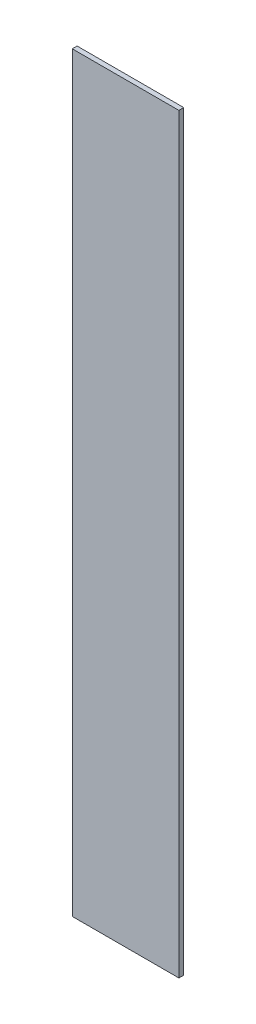
ISO-10303-21;
HEADER;
FILE_DESCRIPTION(('STEP AP214'),'2;1');
FILE_NAME('part.step','',(''),(''),'','','');
FILE_SCHEMA(('AUTOMOTIVE_DESIGN { 1 0 10303 214 1 1 1 1 }'));
ENDSEC;
DATA;
#1=APPLICATION_CONTEXT('core data for automotive mechanical design processes');
#2=APPLICATION_PROTOCOL_DEFINITION('international standard','automotive_design',2000,#1);
#3=PRODUCT_CONTEXT('',#1,'mechanical');
#4=PRODUCT('Part','Part','',(#3));
#5=PRODUCT_RELATED_PRODUCT_CATEGORY('part','',(#4));
#6=PRODUCT_DEFINITION_FORMATION('','',#4);
#7=PRODUCT_DEFINITION_CONTEXT('part definition',#1,'design');
#8=PRODUCT_DEFINITION('design','',#6,#7);
#9=PRODUCT_DEFINITION_SHAPE('','',#8);
#10=(LENGTH_UNIT() NAMED_UNIT(*) SI_UNIT(.MILLI.,.METRE.));
#11=(NAMED_UNIT(*) PLANE_ANGLE_UNIT() SI_UNIT($,.RADIAN.));
#12=(NAMED_UNIT(*) SI_UNIT($,.STERADIAN.) SOLID_ANGLE_UNIT());
#13=UNCERTAINTY_MEASURE_WITH_UNIT(LENGTH_MEASURE(1.E-05),#10,'distance_accuracy_value','');
#14=(GEOMETRIC_REPRESENTATION_CONTEXT(3) GLOBAL_UNCERTAINTY_ASSIGNED_CONTEXT((#13)) GLOBAL_UNIT_ASSIGNED_CONTEXT((#10,
#11,#12)) REPRESENTATION_CONTEXT('',''));
#15=CARTESIAN_POINT('',(0.,0.,0.));
#16=DIRECTION('',(0.,0.,1.));
#17=DIRECTION('',(1.,0.,0.));
#18=AXIS2_PLACEMENT_3D('',#15,#16,#17);
#19=CARTESIAN_POINT('',(-5.32499999999902,3.97499999999934,0.0762));
#20=DIRECTION('',(0.,0.,-1.));
#21=DIRECTION('',(-1.,0.,0.));
#22=AXIS2_PLACEMENT_3D('',#19,#20,#21);
#23=PLANE('',#22);
#24=DIRECTION('',(0.,1.,0.));
#25=VECTOR('',#24,1.);
#26=CARTESIAN_POINT('',(-1.64000000000004,3.1250000000002,0.0762));
#27=LINE('',#26,#25);
#28=CARTESIAN_POINT('',(-1.64000000000004,3.1250000000002,0.0762));
#29=VERTEX_POINT('',#28);
#30=CARTESIAN_POINT('',(-1.64000000000004,4.67499999999908,0.0762));
#31=VERTEX_POINT('',#30);
#32=EDGE_CURVE('E20',#29,#31,#27,.T.);
#33=ORIENTED_EDGE('',*,*,#32,.F.);
#34=DIRECTION('',(1.,0.,0.));
#35=VECTOR('',#34,1.);
#36=CARTESIAN_POINT('',(-1.85999999999993,3.1250000000002,0.0762));
#37=LINE('',#36,#35);
#38=CARTESIAN_POINT('',(-1.85999999999993,3.1250000000002,0.0762));
#39=VERTEX_POINT('',#38);
#40=EDGE_CURVE('E81',#39,#29,#37,.T.);
#41=ORIENTED_EDGE('',*,*,#40,.F.);
#42=DIRECTION('',(0.,1.,0.));
#43=VECTOR('',#42,1.);
#44=CARTESIAN_POINT('',(-1.85999999999993,4.67499999999908,0.0762));
#45=LINE('',#44,#43);
#46=CARTESIAN_POINT('',(-1.85999999999993,4.67499999999908,0.0762));
#47=VERTEX_POINT('',#46);
#48=EDGE_CURVE('E68',#47,#39,#45,.F.);
#49=ORIENTED_EDGE('',*,*,#48,.F.);
#50=DIRECTION('',(1.,0.,0.));
#51=VECTOR('',#50,1.);
#52=CARTESIAN_POINT('',(-1.64000000000004,4.67499999999908,0.0762));
#53=LINE('',#52,#51);
#54=EDGE_CURVE('E55',#31,#47,#53,.F.);
#55=ORIENTED_EDGE('',*,*,#54,.F.);
#56=EDGE_LOOP('',(#33,#41,#49,#55));
#57=FACE_BOUND('',#56,.T.);
#58=ADVANCED_FACE('F17',(#57),#23,.T.);
#59=CARTESIAN_POINT('',(-1.64000000000004,3.1250000000002,0.0762));
#60=DIRECTION('',(1.,0.,0.));
#61=DIRECTION('',(0.,0.,-1.));
#62=AXIS2_PLACEMENT_3D('',#59,#60,#61);
#63=PLANE('',#62);
#64=DIRECTION('',(0.,0.,-1.));
#65=VECTOR('',#64,1.);
#66=CARTESIAN_POINT('',(-1.64000000000004,3.1250000000002,0.0762));
#67=LINE('',#66,#65);
#68=CARTESIAN_POINT('',(-1.64000000000004,3.1250000000002,0.0862000000000108));
#69=VERTEX_POINT('',#68);
#70=EDGE_CURVE('E64',#29,#69,#67,.F.);
#71=ORIENTED_EDGE('',*,*,#70,.F.);
#72=ORIENTED_EDGE('',*,*,#32,.T.);
#73=DIRECTION('',(0.,0.,1.));
#74=VECTOR('',#73,1.);
#75=CARTESIAN_POINT('',(-1.64000000000004,4.67499999999908,0.0762));
#76=LINE('',#75,#74);
#77=CARTESIAN_POINT('',(-1.64000000000004,4.67499999999908,0.0862000000000108));
#78=VERTEX_POINT('',#77);
#79=EDGE_CURVE('E61',#78,#31,#76,.F.);
#80=ORIENTED_EDGE('',*,*,#79,.F.);
#81=DIRECTION('',(0.,1.,0.));
#82=VECTOR('',#81,1.);
#83=CARTESIAN_POINT('',(-1.64000000000004,0.,0.0862000000000108));
#84=LINE('',#83,#82);
#85=EDGE_CURVE('E83',#69,#78,#84,.T.);
#86=ORIENTED_EDGE('',*,*,#85,.F.);
#87=EDGE_LOOP('',(#71,#72,#80,#86));
#88=FACE_BOUND('',#87,.T.);
#89=ADVANCED_FACE('F60',(#88),#63,.T.);
#90=CARTESIAN_POINT('',(-1.64000000000004,4.67499999999908,0.0762));
#91=DIRECTION('',(0.,1.,0.));
#92=DIRECTION('',(0.,0.,1.));
#93=AXIS2_PLACEMENT_3D('',#90,#91,#92);
#94=PLANE('',#93);
#95=ORIENTED_EDGE('',*,*,#79,.T.);
#96=ORIENTED_EDGE('',*,*,#54,.T.);
#97=DIRECTION('',(0.,0.,1.));
#98=VECTOR('',#97,1.);
#99=CARTESIAN_POINT('',(-1.85999999999993,4.67499999999908,0.0762));
#100=LINE('',#99,#98);
#101=CARTESIAN_POINT('',(-1.85999999999993,4.67499999999908,0.0862000000000108));
#102=VERTEX_POINT('',#101);
#103=EDGE_CURVE('E70',#102,#47,#100,.F.);
#104=ORIENTED_EDGE('',*,*,#103,.F.);
#105=DIRECTION('',(1.,0.,0.));
#106=VECTOR('',#105,1.);
#107=CARTESIAN_POINT('',(0.,4.67499999999908,0.0862000000000108));
#108=LINE('',#107,#106);
#109=EDGE_CURVE('E74',#78,#102,#108,.F.);
#110=ORIENTED_EDGE('',*,*,#109,.F.);
#111=EDGE_LOOP('',(#95,#96,#104,#110));
#112=FACE_BOUND('',#111,.T.);
#113=ADVANCED_FACE('F72',(#112),#94,.T.);
#114=CARTESIAN_POINT('',(-1.85999999999993,4.67499999999908,0.0762));
#115=DIRECTION('',(-1.,0.,0.));
#116=DIRECTION('',(0.,0.,1.));
#117=AXIS2_PLACEMENT_3D('',#114,#115,#116);
#118=PLANE('',#117);
#119=ORIENTED_EDGE('',*,*,#103,.T.);
#120=ORIENTED_EDGE('',*,*,#48,.T.);
#121=DIRECTION('',(0.,0.,-1.));
#122=VECTOR('',#121,1.);
#123=CARTESIAN_POINT('',(-1.85999999999993,3.1250000000002,0.0762));
#124=LINE('',#123,#122);
#125=CARTESIAN_POINT('',(-1.85999999999993,3.1250000000002,0.0862000000000108));
#126=VERTEX_POINT('',#125);
#127=EDGE_CURVE('E35',#126,#39,#124,.T.);
#128=ORIENTED_EDGE('',*,*,#127,.F.);
#129=DIRECTION('',(0.,1.,0.));
#130=VECTOR('',#129,1.);
#131=CARTESIAN_POINT('',(-1.85999999999993,0.,0.0862000000000108));
#132=LINE('',#131,#130);
#133=EDGE_CURVE('E26',#102,#126,#132,.F.);
#134=ORIENTED_EDGE('',*,*,#133,.F.);
#135=EDGE_LOOP('',(#119,#120,#128,#134));
#136=FACE_BOUND('',#135,.T.);
#137=ADVANCED_FACE('F89',(#136),#118,.T.);
#138=CARTESIAN_POINT('',(-1.85999999999993,3.1250000000002,0.0762));
#139=DIRECTION('',(0.,-1.,0.));
#140=DIRECTION('',(0.,0.,-1.));
#141=AXIS2_PLACEMENT_3D('',#138,#139,#140);
#142=PLANE('',#141);
#143=ORIENTED_EDGE('',*,*,#127,.T.);
#144=ORIENTED_EDGE('',*,*,#40,.T.);
#145=ORIENTED_EDGE('',*,*,#70,.T.);
#146=DIRECTION('',(1.,0.,0.));
#147=VECTOR('',#146,1.);
#148=CARTESIAN_POINT('',(0.,3.1250000000002,0.0862000000000108));
#149=LINE('',#148,#147);
#150=EDGE_CURVE('E11',#126,#69,#149,.T.);
#151=ORIENTED_EDGE('',*,*,#150,.F.);
#152=EDGE_LOOP('',(#143,#144,#145,#151));
#153=FACE_BOUND('',#152,.T.);
#154=ADVANCED_FACE('F91',(#153),#142,.T.);
#155=CARTESIAN_POINT('',(0.,0.,0.0862000000000108));
#156=DIRECTION('',(0.,0.,1.));
#157=DIRECTION('',(1.,0.,0.));
#158=AXIS2_PLACEMENT_3D('',#155,#156,#157);
#159=PLANE('',#158);
#160=ORIENTED_EDGE('',*,*,#133,.T.);
#161=ORIENTED_EDGE('',*,*,#150,.T.);
#162=ORIENTED_EDGE('',*,*,#85,.T.);
#163=ORIENTED_EDGE('',*,*,#109,.T.);
#164=EDGE_LOOP('',(#160,#161,#162,#163));
#165=FACE_BOUND('',#164,.T.);
#166=ADVANCED_FACE('F88',(#165),#159,.T.);
#167=CLOSED_SHELL('',(#58,#89,#113,#137,#154,#166));
#168=MANIFOLD_SOLID_BREP('B1',#167);
#169=ADVANCED_BREP_SHAPE_REPRESENTATION('',(#18,#168),#14);
#170=SHAPE_DEFINITION_REPRESENTATION(#9,#169);
ENDSEC;
END-ISO-10303-21;
